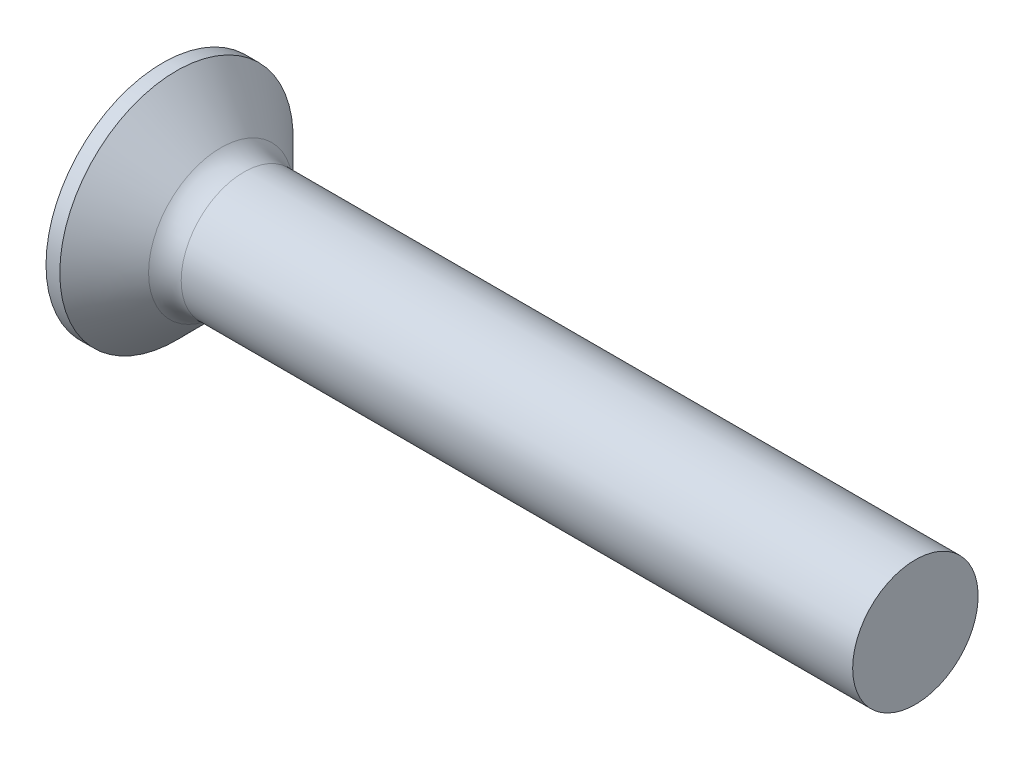
ISO-10303-21;
HEADER;
FILE_DESCRIPTION(('STEP AP214'),'2;1');
FILE_NAME('part.step','',(''),(''),'','','');
FILE_SCHEMA(('AUTOMOTIVE_DESIGN { 1 0 10303 214 1 1 1 1 }'));
ENDSEC;
DATA;
#1=APPLICATION_CONTEXT('core data for automotive mechanical design processes');
#2=APPLICATION_PROTOCOL_DEFINITION('international standard','automotive_design',2000,#1);
#3=PRODUCT_CONTEXT('',#1,'mechanical');
#4=PRODUCT('Part','Part','',(#3));
#5=PRODUCT_RELATED_PRODUCT_CATEGORY('part','',(#4));
#6=PRODUCT_DEFINITION_FORMATION('','',#4);
#7=PRODUCT_DEFINITION_CONTEXT('part definition',#1,'design');
#8=PRODUCT_DEFINITION('design','',#6,#7);
#9=PRODUCT_DEFINITION_SHAPE('','',#8);
#10=(LENGTH_UNIT() NAMED_UNIT(*) SI_UNIT(.MILLI.,.METRE.));
#11=(NAMED_UNIT(*) PLANE_ANGLE_UNIT() SI_UNIT($,.RADIAN.));
#12=(NAMED_UNIT(*) SI_UNIT($,.STERADIAN.) SOLID_ANGLE_UNIT());
#13=UNCERTAINTY_MEASURE_WITH_UNIT(LENGTH_MEASURE(1.E-05),#10,'distance_accuracy_value','');
#14=(GEOMETRIC_REPRESENTATION_CONTEXT(3) GLOBAL_UNCERTAINTY_ASSIGNED_CONTEXT((#13)) GLOBAL_UNIT_ASSIGNED_CONTEXT((#10,
#11,#12)) REPRESENTATION_CONTEXT('',''));
#15=CARTESIAN_POINT('',(0.,0.,0.));
#16=DIRECTION('',(0.,0.,1.));
#17=DIRECTION('',(1.,0.,0.));
#18=AXIS2_PLACEMENT_3D('',#15,#16,#17);
#19=CARTESIAN_POINT('',(3.05,-0.929326349741566,0.515));
#20=DIRECTION('',(0.,0.,-1.));
#21=DIRECTION('',(0.,1.,0.));
#22=AXIS2_PLACEMENT_3D('',#19,#20,#21);
#23=PLANE('',#22);
#24=DIRECTION('',(0.,-1.,0.));
#25=VECTOR('',#24,1.);
#26=CARTESIAN_POINT('',(0.,2.45,0.515));
#27=LINE('',#26,#25);
#28=CARTESIAN_POINT('',(0.,-0.931375357653026,0.515));
#29=VERTEX_POINT('',#28);
#30=CARTESIAN_POINT('',(0.,-2.45,0.515));
#31=VERTEX_POINT('',#30);
#32=EDGE_CURVE('E341',#29,#31,#27,.T.);
#33=ORIENTED_EDGE('',*,*,#32,.F.);
#34=CARTESIAN_POINT('',(-1.54221347305349,-1.05291860734043,0.515));
#35=CARTESIAN_POINT('',(-1.22007147016316,-1.02783607001973,0.515));
#36=CARTESIAN_POINT('',(-0.89794181675164,-1.002592893973,0.515));
#37=CARTESIAN_POINT('',(-0.253713842852044,-0.951673528807875,0.515));
#38=CARTESIAN_POINT('',(0.0683844773279268,-0.925997335794192,0.515));
#39=CARTESIAN_POINT('',(0.712537341146251,-0.874100649412192,0.515));
#40=CARTESIAN_POINT('',(1.03459188478602,-0.847880156061489,0.515));
#41=CARTESIAN_POINT('',(1.67864013954242,-0.794723210967585,0.515));
#42=CARTESIAN_POINT('',(2.0006338510091,-0.767786763479056,0.515));
#43=CARTESIAN_POINT('',(2.56056239677505,-0.720091607539809,0.515));
#44=CARTESIAN_POINT('',(2.7985160340986,-0.699554136185312,0.515));
#45=CARTESIAN_POINT('',(3.27436149939218,-0.657782810112313,0.515));
#46=CARTESIAN_POINT('',(3.51225332755344,-0.636548957574876,0.515));
#47=CARTESIAN_POINT('',(3.98796007755392,-0.59316517097504,0.515));
#48=CARTESIAN_POINT('',(4.22577499737104,-0.571015214531953,0.515));
#49=CARTESIAN_POINT('',(4.70127802763926,-0.525368927832394,0.515));
#50=CARTESIAN_POINT('',(4.93896613655203,-0.50187258160175,0.515));
#51=CARTESIAN_POINT('',(5.17656597464715,-0.477487906778812,0.515));
#52=B_SPLINE_CURVE_WITH_KNOTS('',3,(#34,#35,#36,#37,#38,#39,#40,#41,#42,#43,#44,#45,#46,#47,#48,
#49,#50,#51),.UNSPECIFIED.,.F.,.F.,(4,2,2,2,2,2,2,2,4),(0.,0.969351235948301,1.93871119655371,
2.90807112578744,3.87742529573196,4.59393929763426,5.3104510556289,6.0269803285681,
6.74351810449256),.UNSPECIFIED.);
#53=CARTESIAN_POINT('',(3.05,-0.677477674908922,0.515));
#54=VERTEX_POINT('',#53);
#55=EDGE_CURVE('E198',#29,#54,#52,.T.);
#56=ORIENTED_EDGE('',*,*,#55,.T.);
#57=DIRECTION('',(0.,-1.,0.));
#58=VECTOR('',#57,1.);
#59=CARTESIAN_POINT('',(3.05,0.929326349741566,0.515));
#60=LINE('',#59,#58);
#61=CARTESIAN_POINT('',(3.05,-0.929326349741566,0.515));
#62=VERTEX_POINT('',#61);
#63=EDGE_CURVE('E373',#54,#62,#60,.T.);
#64=ORIENTED_EDGE('',*,*,#63,.T.);
#65=DIRECTION('',(0.894934391398443,0.446197753347436,0.));
#66=VECTOR('',#65,1.);
#67=CARTESIAN_POINT('',(0.,-2.45,0.515));
#68=LINE('',#67,#66);
#69=EDGE_CURVE('E355',#31,#62,#68,.T.);
#70=ORIENTED_EDGE('',*,*,#69,.F.);
#71=EDGE_LOOP('',(#33,#56,#64,#70));
#72=FACE_BOUND('',#71,.T.);
#73=ADVANCED_FACE('F39',(#72),#23,.T.);
#74=CARTESIAN_POINT('',(3.05,0.929326349741566,0.515));
#75=VERTEX_POINT('',#74);
#76=CARTESIAN_POINT('',(3.05,0.677477674908922,0.515));
#77=VERTEX_POINT('',#76);
#78=EDGE_CURVE('E375',#75,#77,#60,.T.);
#79=ORIENTED_EDGE('',*,*,#78,.T.);
#80=CARTESIAN_POINT('',(-1.54221347305349,1.05291860734043,0.515));
#81=CARTESIAN_POINT('',(-1.22007147016316,1.02783607001973,0.515));
#82=CARTESIAN_POINT('',(-0.89794181675164,1.002592893973,0.515));
#83=CARTESIAN_POINT('',(-0.253713842852044,0.951673528807875,0.515));
#84=CARTESIAN_POINT('',(0.0683844773279269,0.925997335794192,0.515));
#85=CARTESIAN_POINT('',(0.712537341146252,0.874100649412192,0.515));
#86=CARTESIAN_POINT('',(1.03459188478602,0.847880156061489,0.515));
#87=CARTESIAN_POINT('',(1.67864013954242,0.794723210967585,0.515));
#88=CARTESIAN_POINT('',(2.0006338510091,0.767786763479056,0.515));
#89=CARTESIAN_POINT('',(2.56056239677505,0.720091607539809,0.515));
#90=CARTESIAN_POINT('',(2.7985160340986,0.699554136185312,0.515));
#91=CARTESIAN_POINT('',(3.27436149939217,0.657782810112313,0.515));
#92=CARTESIAN_POINT('',(3.51225332755344,0.636548957574876,0.515));
#93=CARTESIAN_POINT('',(3.98796007755392,0.59316517097504,0.515));
#94=CARTESIAN_POINT('',(4.22577499737104,0.571015214531953,0.515));
#95=CARTESIAN_POINT('',(4.70127802763926,0.525368927832394,0.515));
#96=CARTESIAN_POINT('',(4.93896613655203,0.50187258160175,0.515));
#97=CARTESIAN_POINT('',(5.17656597464715,0.477487906778812,0.515));
#98=B_SPLINE_CURVE_WITH_KNOTS('',3,(#80,#81,#82,#83,#84,#85,#86,#87,#88,#89,#90,#91,#92,#93,#94,
#95,#96,#97),.UNSPECIFIED.,.F.,.F.,(4,2,2,2,2,2,2,2,4),(0.,0.969351235948301,1.93871119655371,
2.90807112578744,3.87742529573196,4.59393929763426,5.3104510556289,6.0269803285681,
6.74351810449256),.UNSPECIFIED.);
#99=CARTESIAN_POINT('',(0.,0.931375357653026,0.515));
#100=VERTEX_POINT('',#99);
#101=EDGE_CURVE('E191',#77,#100,#98,.F.);
#102=ORIENTED_EDGE('',*,*,#101,.T.);
#103=CARTESIAN_POINT('',(0.,2.45,0.515));
#104=VERTEX_POINT('',#103);
#105=EDGE_CURVE('E343',#104,#100,#27,.T.);
#106=ORIENTED_EDGE('',*,*,#105,.F.);
#107=DIRECTION('',(0.894934391398443,-0.446197753347436,0.));
#108=VECTOR('',#107,1.);
#109=CARTESIAN_POINT('',(0.,2.45,0.515));
#110=LINE('',#109,#108);
#111=EDGE_CURVE('E69',#104,#75,#110,.T.);
#112=ORIENTED_EDGE('',*,*,#111,.T.);
#113=EDGE_LOOP('',(#79,#102,#106,#112));
#114=FACE_BOUND('',#113,.T.);
#115=ADVANCED_FACE('F173',(#114),#23,.T.);
#116=CARTESIAN_POINT('',(3.05,0.929326349741566,-0.515));
#117=DIRECTION('',(0.,0.,1.));
#118=DIRECTION('',(1.,0.,0.));
#119=AXIS2_PLACEMENT_3D('',#116,#117,#118);
#120=PLANE('',#119);
#121=DIRECTION('',(0.,1.,0.));
#122=VECTOR('',#121,1.);
#123=CARTESIAN_POINT('',(3.05,-0.929326349741566,-0.515));
#124=LINE('',#123,#122);
#125=CARTESIAN_POINT('',(3.05,-0.929326349741566,-0.515));
#126=VERTEX_POINT('',#125);
#127=CARTESIAN_POINT('',(3.05,-0.677477674908922,-0.515));
#128=VERTEX_POINT('',#127);
#129=EDGE_CURVE('E374',#126,#128,#124,.T.);
#130=ORIENTED_EDGE('',*,*,#129,.T.);
#131=CARTESIAN_POINT('',(-1.54221347058903,-1.05291860714859,-0.515));
#132=CARTESIAN_POINT('',(-1.22007146800241,-1.02783606985067,-0.515));
#133=CARTESIAN_POINT('',(-0.897941814894599,-1.00259289382691,-0.515));
#134=CARTESIAN_POINT('',(-0.253713841602368,-0.951673528708394,-0.515));
#135=CARTESIAN_POINT('',(0.0683844782739385,-0.925997335718345,-0.515));
#136=CARTESIAN_POINT('',(0.712537341258934,-0.874100649402746,-0.515));
#137=CARTESIAN_POINT('',(1.03459188436907,-0.847880156095195,-0.515));
#138=CARTESIAN_POINT('',(1.67864013806642,-0.794723211090119,-0.515));
#139=CARTESIAN_POINT('',(2.00063384900369,-0.767786763647266,-0.515));
#140=CARTESIAN_POINT('',(2.56056239424054,-0.720091607757629,-0.515));
#141=CARTESIAN_POINT('',(2.79851603156427,-0.699554136405275,-0.515));
#142=CARTESIAN_POINT('',(3.27436149685826,-0.657782810337244,-0.515));
#143=CARTESIAN_POINT('',(3.51225332501977,-0.636548957802634,-0.515));
#144=CARTESIAN_POINT('',(3.98796007502083,-0.593165171209449,-0.515));
#145=CARTESIAN_POINT('',(4.22577499483828,-0.571015214770186,-0.515));
#146=CARTESIAN_POINT('',(4.70127802510735,-0.525368928080089,-0.515));
#147=CARTESIAN_POINT('',(4.93896613402064,-0.501872581855082,-0.515));
#148=CARTESIAN_POINT('',(5.17656597211643,-0.477487907039094,-0.515));
#149=B_SPLINE_CURVE_WITH_KNOTS('',3,(#131,#132,#133,#134,#135,#136,#137,#138,#139,#140,#141,
#142,#143,#144,#145,#146,#147,#148),.UNSPECIFIED.,.F.,.F.,(4,2,2,2,2,2,2,2,4),(0.,
0.9693512350346,1.93871119472626,2.90807112236582,3.87742529071622,4.59393929261848,
5.3104510506131,6.02698032355223,6.74351809947659),.UNSPECIFIED.);
#150=CARTESIAN_POINT('',(0.,-0.931375357653026,-0.515));
#151=VERTEX_POINT('',#150);
#152=EDGE_CURVE('E245',#128,#151,#149,.F.);
#153=ORIENTED_EDGE('',*,*,#152,.T.);
#154=DIRECTION('',(0.,1.,0.));
#155=VECTOR('',#154,1.);
#156=CARTESIAN_POINT('',(0.,-2.45,-0.515));
#157=LINE('',#156,#155);
#158=CARTESIAN_POINT('',(0.,-2.45,-0.515));
#159=VERTEX_POINT('',#158);
#160=EDGE_CURVE('E342',#159,#151,#157,.T.);
#161=ORIENTED_EDGE('',*,*,#160,.F.);
#162=DIRECTION('',(0.894934391398443,0.446197753347436,0.));
#163=VECTOR('',#162,1.);
#164=CARTESIAN_POINT('',(0.,-2.45,-0.515));
#165=LINE('',#164,#163);
#166=EDGE_CURVE('E359',#159,#126,#165,.T.);
#167=ORIENTED_EDGE('',*,*,#166,.T.);
#168=EDGE_LOOP('',(#130,#153,#161,#167));
#169=FACE_BOUND('',#168,.T.);
#170=ADVANCED_FACE('F179',(#169),#120,.T.);
#171=CARTESIAN_POINT('',(0.,0.931375357653026,-0.515));
#172=VERTEX_POINT('',#171);
#173=CARTESIAN_POINT('',(0.,2.45,-0.515));
#174=VERTEX_POINT('',#173);
#175=EDGE_CURVE('E354',#172,#174,#157,.T.);
#176=ORIENTED_EDGE('',*,*,#175,.F.);
#177=CARTESIAN_POINT('',(-1.54221347058903,1.05291860714859,-0.515));
#178=CARTESIAN_POINT('',(-1.22007146800241,1.02783606985067,-0.515));
#179=CARTESIAN_POINT('',(-0.897941814894599,1.00259289382691,-0.515));
#180=CARTESIAN_POINT('',(-0.253713841602368,0.951673528708394,-0.515));
#181=CARTESIAN_POINT('',(0.0683844782739385,0.925997335718345,-0.515));
#182=CARTESIAN_POINT('',(0.712537341258934,0.874100649402746,-0.515));
#183=CARTESIAN_POINT('',(1.03459188436907,0.847880156095195,-0.515));
#184=CARTESIAN_POINT('',(1.67864013806642,0.794723211090119,-0.515));
#185=CARTESIAN_POINT('',(2.00063384900369,0.767786763647266,-0.515));
#186=CARTESIAN_POINT('',(2.56056239424054,0.720091607757629,-0.515));
#187=CARTESIAN_POINT('',(2.79851603156427,0.699554136405275,-0.515));
#188=CARTESIAN_POINT('',(3.27436149685826,0.657782810337244,-0.515));
#189=CARTESIAN_POINT('',(3.51225332501977,0.636548957802634,-0.515));
#190=CARTESIAN_POINT('',(3.98796007502083,0.593165171209449,-0.515));
#191=CARTESIAN_POINT('',(4.22577499483827,0.571015214770186,-0.515));
#192=CARTESIAN_POINT('',(4.70127802510734,0.525368928080089,-0.515));
#193=CARTESIAN_POINT('',(4.93896613402064,0.501872581855082,-0.515));
#194=CARTESIAN_POINT('',(5.17656597211643,0.477487907039095,-0.515));
#195=B_SPLINE_CURVE_WITH_KNOTS('',3,(#177,#178,#179,#180,#181,#182,#183,#184,#185,#186,#187,
#188,#189,#190,#191,#192,#193,#194),.UNSPECIFIED.,.F.,.F.,(4,2,2,2,2,2,2,2,4),(0.,
0.9693512350346,1.93871119472626,2.90807112236582,3.87742529071622,4.59393929261848,
5.3104510506131,6.02698032355223,6.74351809947659),.UNSPECIFIED.);
#196=CARTESIAN_POINT('',(3.05,0.677477674908922,-0.515));
#197=VERTEX_POINT('',#196);
#198=EDGE_CURVE('E240',#172,#197,#195,.T.);
#199=ORIENTED_EDGE('',*,*,#198,.T.);
#200=CARTESIAN_POINT('',(3.05,0.929326349741566,-0.515));
#201=VERTEX_POINT('',#200);
#202=EDGE_CURVE('E383',#197,#201,#124,.T.);
#203=ORIENTED_EDGE('',*,*,#202,.T.);
#204=DIRECTION('',(0.894934391398443,-0.446197753347436,0.));
#205=VECTOR('',#204,1.);
#206=CARTESIAN_POINT('',(0.,2.45,-0.515));
#207=LINE('',#206,#205);
#208=EDGE_CURVE('E365',#174,#201,#207,.T.);
#209=ORIENTED_EDGE('',*,*,#208,.F.);
#210=EDGE_LOOP('',(#176,#199,#203,#209));
#211=FACE_BOUND('',#210,.T.);
#212=ADVANCED_FACE('F477',(#211),#120,.T.);
#213=CARTESIAN_POINT('',(3.05,0.929326349741566,-0.515));
#214=DIRECTION('',(1.,0.,0.));
#215=DIRECTION('',(0.,0.,-1.));
#216=AXIS2_PLACEMENT_3D('',#213,#214,#215);
#217=PLANE('',#216);
#218=CARTESIAN_POINT('',(3.05,0.,0.));
#219=DIRECTION('',(-1.,0.,0.));
#220=DIRECTION('',(0.,0.,1.));
#221=AXIS2_PLACEMENT_3D('',#218,#219,#220);
#222=CIRCLE('',#221,0.850999999999999);
#223=EDGE_CURVE('E303',#128,#54,#222,.T.);
#224=ORIENTED_EDGE('',*,*,#223,.F.);
#225=ORIENTED_EDGE('',*,*,#129,.F.);
#226=DIRECTION('',(0.,0.,-1.));
#227=VECTOR('',#226,1.);
#228=CARTESIAN_POINT('',(3.05,-0.929326349741566,0.515));
#229=LINE('',#228,#227);
#230=EDGE_CURVE('E369',#62,#126,#229,.T.);
#231=ORIENTED_EDGE('',*,*,#230,.F.);
#232=ORIENTED_EDGE('',*,*,#63,.F.);
#233=EDGE_LOOP('',(#224,#225,#231,#232));
#234=FACE_BOUND('',#233,.T.);
#235=ADVANCED_FACE('F472',(#234),#217,.F.);
#236=CARTESIAN_POINT('',(3.05,-0.515000000000002,0.67747767490892));
#237=VERTEX_POINT('',#236);
#238=CARTESIAN_POINT('',(3.05,0.514999999999998,0.677477674908924));
#239=VERTEX_POINT('',#238);
#240=EDGE_CURVE('E293',#237,#239,#222,.T.);
#241=ORIENTED_EDGE('',*,*,#240,.F.);
#242=DIRECTION('',(0.,0.,-1.));
#243=VECTOR('',#242,1.);
#244=CARTESIAN_POINT('',(3.05,-0.515000000000003,0.929326349741565));
#245=LINE('',#244,#243);
#246=CARTESIAN_POINT('',(3.05,-0.515000000000003,0.929326349741565));
#247=VERTEX_POINT('',#246);
#248=EDGE_CURVE('E454',#247,#237,#245,.T.);
#249=ORIENTED_EDGE('',*,*,#248,.F.);
#250=DIRECTION('',(0.,-1.,0.));
#251=VECTOR('',#250,1.);
#252=CARTESIAN_POINT('',(3.05,0.514999999999997,0.929326349741568));
#253=LINE('',#252,#251);
#254=CARTESIAN_POINT('',(3.05,0.514999999999997,0.929326349741568));
#255=VERTEX_POINT('',#254);
#256=EDGE_CURVE('E327',#255,#247,#253,.T.);
#257=ORIENTED_EDGE('',*,*,#256,.F.);
#258=DIRECTION('',(0.,0.,1.));
#259=VECTOR('',#258,1.);
#260=CARTESIAN_POINT('',(3.05,0.515000000000003,-0.929326349741565));
#261=LINE('',#260,#259);
#262=EDGE_CURVE('E206',#239,#255,#261,.T.);
#263=ORIENTED_EDGE('',*,*,#262,.F.);
#264=EDGE_LOOP('',(#241,#249,#257,#263));
#265=FACE_BOUND('',#264,.T.);
#266=ADVANCED_FACE('F518',(#265),#217,.F.);
#267=EDGE_CURVE('E292',#77,#197,#222,.T.);
#268=ORIENTED_EDGE('',*,*,#267,.F.);
#269=ORIENTED_EDGE('',*,*,#78,.F.);
#270=DIRECTION('',(0.,0.,1.));
#271=VECTOR('',#270,1.);
#272=CARTESIAN_POINT('',(3.05,0.929326349741566,-0.515));
#273=LINE('',#272,#271);
#274=EDGE_CURVE('E370',#201,#75,#273,.T.);
#275=ORIENTED_EDGE('',*,*,#274,.F.);
#276=ORIENTED_EDGE('',*,*,#202,.F.);
#277=EDGE_LOOP('',(#268,#269,#275,#276));
#278=FACE_BOUND('',#277,.T.);
#279=ADVANCED_FACE('F480',(#278),#217,.F.);
#280=CARTESIAN_POINT('',(3.05,0.514999999999997,0.929326349741568));
#281=DIRECTION('',(0.,-1.,0.));
#282=DIRECTION('',(1.,0.,0.));
#283=AXIS2_PLACEMENT_3D('',#280,#281,#282);
#284=PLANE('',#283);
#285=CARTESIAN_POINT('',(3.05,0.515000000000003,-0.929326349741565));
#286=VERTEX_POINT('',#285);
#287=CARTESIAN_POINT('',(3.05,0.515000000000002,-0.67747767490892));
#288=VERTEX_POINT('',#287);
#289=EDGE_CURVE('E321',#286,#288,#261,.T.);
#290=ORIENTED_EDGE('',*,*,#289,.T.);
#291=CARTESIAN_POINT('',(-1.54221347058903,0.515000000000004,-1.05291860714859));
#292=CARTESIAN_POINT('',(-1.22007146800242,0.515000000000003,-1.02783606985067));
#293=CARTESIAN_POINT('',(-0.897941814894599,0.515000000000003,-1.00259289382691));
#294=CARTESIAN_POINT('',(-0.253713841602369,0.515000000000003,-0.951673528708392));
#295=CARTESIAN_POINT('',(0.0683844782739381,0.515000000000003,-0.925997335718343));
#296=CARTESIAN_POINT('',(0.712537341258934,0.515000000000003,-0.874100649402745));
#297=CARTESIAN_POINT('',(1.03459188436907,0.515000000000003,-0.847880156095193));
#298=CARTESIAN_POINT('',(1.67864013806642,0.515000000000003,-0.794723211090117));
#299=CARTESIAN_POINT('',(2.00063384900369,0.515000000000003,-0.767786763647264));
#300=CARTESIAN_POINT('',(2.56056239424054,0.515000000000003,-0.720091607757627));
#301=CARTESIAN_POINT('',(2.79851603156427,0.515000000000003,-0.699554136405273));
#302=CARTESIAN_POINT('',(3.27436149685826,0.515000000000002,-0.657782810337243));
#303=CARTESIAN_POINT('',(3.51225332501977,0.515000000000002,-0.636548957802632));
#304=CARTESIAN_POINT('',(3.98796007502083,0.515000000000002,-0.593165171209447));
#305=CARTESIAN_POINT('',(4.22577499483828,0.515000000000002,-0.571015214770184));
#306=CARTESIAN_POINT('',(4.70127802510735,0.515000000000002,-0.525368928080087));
#307=CARTESIAN_POINT('',(4.93896613402064,0.515000000000002,-0.50187258185508));
#308=CARTESIAN_POINT('',(5.17656597211643,0.515000000000002,-0.477487907039093));
#309=B_SPLINE_CURVE_WITH_KNOTS('',3,(#291,#292,#293,#294,#295,#296,#297,#298,#299,#300,#301,
#302,#303,#304,#305,#306,#307,#308),.UNSPECIFIED.,.F.,.F.,(4,2,2,2,2,2,2,2,4),(0.,
0.969351235034599,1.93871119472626,2.90807112236582,3.87742529071622,4.59393929261848,
5.3104510506131,6.02698032355223,6.74351809947659),.UNSPECIFIED.);
#310=CARTESIAN_POINT('',(0.,0.515000000000003,-0.931375357653024));
#311=VERTEX_POINT('',#310);
#312=EDGE_CURVE('E233',#288,#311,#309,.F.);
#313=ORIENTED_EDGE('',*,*,#312,.T.);
#314=DIRECTION('',(0.,0.,1.));
#315=VECTOR('',#314,1.);
#316=CARTESIAN_POINT('',(0.,0.515000000000009,-2.45));
#317=LINE('',#316,#315);
#318=CARTESIAN_POINT('',(0.,0.515000000000009,-2.45));
#319=VERTEX_POINT('',#318);
#320=EDGE_CURVE('E438',#319,#311,#317,.T.);
#321=ORIENTED_EDGE('',*,*,#320,.F.);
#322=DIRECTION('',(0.894934391398443,0.,0.446197753347436));
#323=VECTOR('',#322,1.);
#324=CARTESIAN_POINT('',(0.,0.515000000000009,-2.45));
#325=LINE('',#324,#323);
#326=EDGE_CURVE('E325',#319,#286,#325,.T.);
#327=ORIENTED_EDGE('',*,*,#326,.T.);
#328=EDGE_LOOP('',(#290,#313,#321,#327));
#329=FACE_BOUND('',#328,.T.);
#330=ADVANCED_FACE('F324',(#329),#284,.T.);
#331=CARTESIAN_POINT('',(3.05,-0.514999999999997,-0.929326349741568));
#332=DIRECTION('',(0.,1.,0.));
#333=DIRECTION('',(0.,0.,1.));
#334=AXIS2_PLACEMENT_3D('',#331,#332,#333);
#335=PLANE('',#334);
#336=DIRECTION('',(0.,0.,-1.));
#337=VECTOR('',#336,1.);
#338=CARTESIAN_POINT('',(0.,-0.515000000000008,2.45));
#339=LINE('',#338,#337);
#340=CARTESIAN_POINT('',(0.,-0.514999999999997,-0.931375357653028));
#341=VERTEX_POINT('',#340);
#342=CARTESIAN_POINT('',(0.,-0.514999999999992,-2.45));
#343=VERTEX_POINT('',#342);
#344=EDGE_CURVE('E432',#341,#343,#339,.T.);
#345=ORIENTED_EDGE('',*,*,#344,.F.);
#346=CARTESIAN_POINT('',(-1.54221347058903,-0.514999999999996,-1.05291860714859));
#347=CARTESIAN_POINT('',(-1.22007146800241,-0.514999999999997,-1.02783606985067));
#348=CARTESIAN_POINT('',(-0.897941814894598,-0.514999999999997,-1.00259289382691));
#349=CARTESIAN_POINT('',(-0.253713841602368,-0.514999999999997,-0.951673528708396));
#350=CARTESIAN_POINT('',(0.0683844782739389,-0.514999999999997,-0.925997335718346));
#351=CARTESIAN_POINT('',(0.712537341258934,-0.514999999999997,-0.874100649402748));
#352=CARTESIAN_POINT('',(1.03459188436907,-0.514999999999997,-0.847880156095197));
#353=CARTESIAN_POINT('',(1.67864013806642,-0.514999999999997,-0.794723211090121));
#354=CARTESIAN_POINT('',(2.00063384900369,-0.514999999999997,-0.767786763647268));
#355=CARTESIAN_POINT('',(2.56056239424054,-0.514999999999998,-0.72009160775763));
#356=CARTESIAN_POINT('',(2.79851603156427,-0.514999999999998,-0.699554136405276));
#357=CARTESIAN_POINT('',(3.27436149685826,-0.514999999999998,-0.657782810337246));
#358=CARTESIAN_POINT('',(3.51225332501977,-0.514999999999998,-0.636548957802636));
#359=CARTESIAN_POINT('',(3.98796007502083,-0.514999999999998,-0.59316517120945));
#360=CARTESIAN_POINT('',(4.22577499483828,-0.514999999999998,-0.571015214770188));
#361=CARTESIAN_POINT('',(4.70127802510735,-0.514999999999999,-0.52536892808009));
#362=CARTESIAN_POINT('',(4.93896613402064,-0.514999999999999,-0.501872581855084));
#363=CARTESIAN_POINT('',(5.17656597211643,-0.514999999999999,-0.477487907039096));
#364=B_SPLINE_CURVE_WITH_KNOTS('',3,(#346,#347,#348,#349,#350,#351,#352,#353,#354,#355,#356,
#357,#358,#359,#360,#361,#362,#363),.UNSPECIFIED.,.F.,.F.,(4,2,2,2,2,2,2,2,4),(0.,
0.969351235034601,1.93871119472626,2.90807112236582,3.87742529071622,4.59393929261848,
5.3104510506131,6.02698032355223,6.74351809947659),.UNSPECIFIED.);
#365=CARTESIAN_POINT('',(3.05,-0.514999999999998,-0.677477674908923));
#366=VERTEX_POINT('',#365);
#367=EDGE_CURVE('E226',#341,#366,#364,.T.);
#368=ORIENTED_EDGE('',*,*,#367,.T.);
#369=CARTESIAN_POINT('',(3.05,-0.514999999999997,-0.929326349741568));
#370=VERTEX_POINT('',#369);
#371=EDGE_CURVE('E323',#366,#370,#245,.T.);
#372=ORIENTED_EDGE('',*,*,#371,.T.);
#373=DIRECTION('',(0.894934391398443,0.,0.446197753347436));
#374=VECTOR('',#373,1.);
#375=CARTESIAN_POINT('',(0.,-0.514999999999992,-2.45));
#376=LINE('',#375,#374);
#377=EDGE_CURVE('E442',#343,#370,#376,.T.);
#378=ORIENTED_EDGE('',*,*,#377,.F.);
#379=EDGE_LOOP('',(#345,#368,#372,#378));
#380=FACE_BOUND('',#379,.T.);
#381=ADVANCED_FACE('F460',(#380),#335,.T.);
#382=ORIENTED_EDGE('',*,*,#248,.T.);
#383=CARTESIAN_POINT('',(-1.54221347305349,-0.515000000000003,1.05291860734043));
#384=CARTESIAN_POINT('',(-1.22007147016316,-0.515000000000003,1.02783607001973));
#385=CARTESIAN_POINT('',(-0.89794181675164,-0.515000000000003,1.002592893973));
#386=CARTESIAN_POINT('',(-0.253713842852044,-0.515000000000003,0.951673528807873));
#387=CARTESIAN_POINT('',(0.0683844773279267,-0.515000000000003,0.92599733579419));
#388=CARTESIAN_POINT('',(0.712537341146251,-0.515000000000003,0.87410064941219));
#389=CARTESIAN_POINT('',(1.03459188478602,-0.515000000000003,0.847880156061488));
#390=CARTESIAN_POINT('',(1.67864013954242,-0.515000000000003,0.794723210967584));
#391=CARTESIAN_POINT('',(2.0006338510091,-0.515000000000003,0.767786763479054));
#392=CARTESIAN_POINT('',(2.56056239677505,-0.515000000000003,0.720091607539807));
#393=CARTESIAN_POINT('',(2.7985160340986,-0.515000000000003,0.69955413618531));
#394=CARTESIAN_POINT('',(3.27436149939218,-0.515000000000002,0.657782810112311));
#395=CARTESIAN_POINT('',(3.51225332755344,-0.515000000000002,0.636548957574874));
#396=CARTESIAN_POINT('',(3.98796007755392,-0.515000000000002,0.593165170975038));
#397=CARTESIAN_POINT('',(4.22577499737104,-0.515000000000002,0.571015214531951));
#398=CARTESIAN_POINT('',(4.70127802763926,-0.515000000000002,0.525368927832392));
#399=CARTESIAN_POINT('',(4.93896613655203,-0.515000000000002,0.501872581601749));
#400=CARTESIAN_POINT('',(5.17656597464715,-0.515000000000002,0.47748790677881));
#401=B_SPLINE_CURVE_WITH_KNOTS('',3,(#383,#384,#385,#386,#387,#388,#389,#390,#391,#392,#393,
#394,#395,#396,#397,#398,#399,#400),.UNSPECIFIED.,.F.,.F.,(4,2,2,2,2,2,2,2,4),(0.,
0.969351235948301,1.93871119655371,2.90807112578744,3.87742529573196,4.59393929763426,
5.3104510556289,6.0269803285681,6.74351810449256),.UNSPECIFIED.);
#402=CARTESIAN_POINT('',(0.,-0.515000000000003,0.931375357653024));
#403=VERTEX_POINT('',#402);
#404=EDGE_CURVE('E218',#237,#403,#401,.F.);
#405=ORIENTED_EDGE('',*,*,#404,.T.);
#406=CARTESIAN_POINT('',(0.,-0.515000000000008,2.45));
#407=VERTEX_POINT('',#406);
#408=EDGE_CURVE('E427',#407,#403,#339,.T.);
#409=ORIENTED_EDGE('',*,*,#408,.F.);
#410=DIRECTION('',(0.894934391398443,0.,-0.446197753347436));
#411=VECTOR('',#410,1.);
#412=CARTESIAN_POINT('',(0.,-0.515000000000008,2.45));
#413=LINE('',#412,#411);
#414=EDGE_CURVE('E448',#407,#247,#413,.T.);
#415=ORIENTED_EDGE('',*,*,#414,.T.);
#416=EDGE_LOOP('',(#382,#405,#409,#415));
#417=FACE_BOUND('',#416,.T.);
#418=ADVANCED_FACE('F500',(#417),#335,.T.);
#419=CARTESIAN_POINT('',(0.,0.514999999999997,0.931375357653028));
#420=VERTEX_POINT('',#419);
#421=CARTESIAN_POINT('',(0.,0.514999999999991,2.45));
#422=VERTEX_POINT('',#421);
#423=EDGE_CURVE('E441',#420,#422,#317,.T.);
#424=ORIENTED_EDGE('',*,*,#423,.F.);
#425=CARTESIAN_POINT('',(-1.54221347058903,0.514999999999996,1.05291860714859));
#426=CARTESIAN_POINT('',(-1.22007146800241,0.514999999999996,1.02783606985067));
#427=CARTESIAN_POINT('',(-0.897941814894599,0.514999999999996,1.00259289382691));
#428=CARTESIAN_POINT('',(-0.253713841602368,0.514999999999997,0.951673528708396));
#429=CARTESIAN_POINT('',(0.0683844782739385,0.514999999999997,0.925997335718346));
#430=CARTESIAN_POINT('',(0.712537341258934,0.514999999999997,0.874100649402748));
#431=CARTESIAN_POINT('',(1.03459188436907,0.514999999999997,0.847880156095197));
#432=CARTESIAN_POINT('',(1.67864013806642,0.514999999999997,0.794723211090121));
#433=CARTESIAN_POINT('',(2.00063384900369,0.514999999999997,0.767786763647268));
#434=CARTESIAN_POINT('',(2.56056239424054,0.514999999999998,0.720091607757631));
#435=CARTESIAN_POINT('',(2.79851603156427,0.514999999999998,0.699554136405277));
#436=CARTESIAN_POINT('',(3.27436149685826,0.514999999999998,0.657782810337246));
#437=CARTESIAN_POINT('',(3.51225332501977,0.514999999999998,0.636548957802636));
#438=CARTESIAN_POINT('',(3.98796007502083,0.514999999999998,0.593165171209451));
#439=CARTESIAN_POINT('',(4.22577499483827,0.514999999999998,0.571015214770188));
#440=CARTESIAN_POINT('',(4.70127802510734,0.514999999999998,0.525368928080091));
#441=CARTESIAN_POINT('',(4.93896613402064,0.514999999999998,0.501872581855084));
#442=CARTESIAN_POINT('',(5.17656597211643,0.514999999999998,0.477487907039096));
#443=B_SPLINE_CURVE_WITH_KNOTS('',3,(#425,#426,#427,#428,#429,#430,#431,#432,#433,#434,#435,
#436,#437,#438,#439,#440,#441,#442),.UNSPECIFIED.,.F.,.F.,(4,2,2,2,2,2,2,2,4),(0.,
0.9693512350346,1.93871119472626,2.90807112236582,3.87742529071622,4.59393929261848,
5.3104510506131,6.02698032355223,6.74351809947659),.UNSPECIFIED.);
#444=EDGE_CURVE('E11',#420,#239,#443,.T.);
#445=ORIENTED_EDGE('',*,*,#444,.T.);
#446=ORIENTED_EDGE('',*,*,#262,.T.);
#447=DIRECTION('',(0.894934391398443,0.,-0.446197753347436));
#448=VECTOR('',#447,1.);
#449=CARTESIAN_POINT('',(0.,0.514999999999991,2.45));
#450=LINE('',#449,#448);
#451=EDGE_CURVE('E451',#422,#255,#450,.T.);
#452=ORIENTED_EDGE('',*,*,#451,.F.);
#453=EDGE_LOOP('',(#424,#445,#446,#452));
#454=FACE_BOUND('',#453,.T.);
#455=ADVANCED_FACE('F425',(#454),#284,.T.);
#456=CARTESIAN_POINT('',(0.,0.,0.));
#457=DIRECTION('',(-1.,0.,0.));
#458=DIRECTION('',(0.,0.,1.));
#459=AXIS2_PLACEMENT_3D('',#456,#457,#458);
#460=PLANE('',#459);
#461=CARTESIAN_POINT('',(0.,0.,0.));
#462=DIRECTION('',(-1.,0.,0.));
#463=DIRECTION('',(0.,0.,1.));
#464=AXIS2_PLACEMENT_3D('',#461,#462,#463);
#465=CIRCLE('',#464,4.65);
#466=CARTESIAN_POINT('',(0.,0.,4.65));
#467=VERTEX_POINT('',#466);
#468=EDGE_CURVE('E391',#467,#467,#465,.T.);
#469=ORIENTED_EDGE('',*,*,#468,.T.);
#470=EDGE_LOOP('',(#469));
#471=FACE_BOUND('',#470,.T.);
#472=ORIENTED_EDGE('',*,*,#408,.T.);
#473=CARTESIAN_POINT('',(0.,0.,0.));
#474=DIRECTION('',(-1.,0.,0.));
#475=DIRECTION('',(0.,0.,1.));
#476=AXIS2_PLACEMENT_3D('',#473,#474,#475);
#477=CIRCLE('',#476,1.06427677642768);
#478=EDGE_CURVE('E282',#29,#403,#477,.T.);
#479=ORIENTED_EDGE('',*,*,#478,.F.);
#480=ORIENTED_EDGE('',*,*,#32,.T.);
#481=DIRECTION('',(0.,0.,-1.));
#482=VECTOR('',#481,1.);
#483=CARTESIAN_POINT('',(0.,-2.45,0.515));
#484=LINE('',#483,#482);
#485=EDGE_CURVE('E347',#31,#159,#484,.T.);
#486=ORIENTED_EDGE('',*,*,#485,.T.);
#487=ORIENTED_EDGE('',*,*,#160,.T.);
#488=EDGE_CURVE('E285',#341,#151,#477,.T.);
#489=ORIENTED_EDGE('',*,*,#488,.F.);
#490=ORIENTED_EDGE('',*,*,#344,.T.);
#491=DIRECTION('',(0.,1.,0.));
#492=VECTOR('',#491,1.);
#493=CARTESIAN_POINT('',(0.,-0.514999999999992,-2.45));
#494=LINE('',#493,#492);
#495=EDGE_CURVE('E431',#343,#319,#494,.T.);
#496=ORIENTED_EDGE('',*,*,#495,.T.);
#497=ORIENTED_EDGE('',*,*,#320,.T.);
#498=EDGE_CURVE('E281',#172,#311,#477,.T.);
#499=ORIENTED_EDGE('',*,*,#498,.F.);
#500=ORIENTED_EDGE('',*,*,#175,.T.);
#501=DIRECTION('',(0.,0.,1.));
#502=VECTOR('',#501,1.);
#503=CARTESIAN_POINT('',(0.,2.45,-0.515));
#504=LINE('',#503,#502);
#505=EDGE_CURVE('E337',#174,#104,#504,.T.);
#506=ORIENTED_EDGE('',*,*,#505,.T.);
#507=ORIENTED_EDGE('',*,*,#105,.T.);
#508=EDGE_CURVE('E276',#420,#100,#477,.T.);
#509=ORIENTED_EDGE('',*,*,#508,.F.);
#510=ORIENTED_EDGE('',*,*,#423,.T.);
#511=DIRECTION('',(0.,-1.,0.));
#512=VECTOR('',#511,1.);
#513=CARTESIAN_POINT('',(0.,0.514999999999991,2.45));
#514=LINE('',#513,#512);
#515=EDGE_CURVE('E207',#422,#407,#514,.T.);
#516=ORIENTED_EDGE('',*,*,#515,.T.);
#517=EDGE_LOOP('',(#472,#479,#480,#486,#487,#489,#490,#496,#497,#499,#500,#506,#507,#509,#510,#516));
#518=FACE_BOUND('',#517,.T.);
#519=ADVANCED_FACE('F419',(#471,#518),#460,.T.);
#520=CARTESIAN_POINT('',(-6.34999999999999,0.,0.));
#521=DIRECTION('',(-1.,0.,0.));
#522=DIRECTION('',(0.,0.,1.));
#523=AXIS2_PLACEMENT_3D('',#520,#521,#522);
#524=CYLINDRICAL_SURFACE('',#523,4.65);
#525=CARTESIAN_POINT('',(0.550000000000008,0.,0.));
#526=DIRECTION('',(-1.,0.,0.));
#527=DIRECTION('',(0.,0.,1.));
#528=AXIS2_PLACEMENT_3D('',#525,#526,#527);
#529=CIRCLE('',#528,4.65);
#530=CARTESIAN_POINT('',(0.550000000000008,0.,4.65));
#531=VERTEX_POINT('',#530);
#532=EDGE_CURVE('E387',#531,#531,#529,.T.);
#533=ORIENTED_EDGE('',*,*,#532,.T.);
#534=EDGE_LOOP('',(#533));
#535=FACE_BOUND('',#534,.T.);
#536=ORIENTED_EDGE('',*,*,#468,.F.);
#537=EDGE_LOOP('',(#536));
#538=FACE_BOUND('',#537,.T.);
#539=ADVANCED_FACE('F413',(#535,#538),#524,.T.);
#540=CARTESIAN_POINT('',(0.550000000000008,0.,0.));
#541=DIRECTION('',(-1.,0.,0.));
#542=DIRECTION('',(0.,0.,1.));
#543=AXIS2_PLACEMENT_3D('',#540,#541,#542);
#544=CONICAL_SURFACE('',#543,4.65,0.78539816339745);
#545=CARTESIAN_POINT('',(2.31923881554251,0.,0.));
#546=DIRECTION('',(-1.,0.,0.));
#547=DIRECTION('',(0.,0.,1.));
#548=AXIS2_PLACEMENT_3D('',#545,#546,#547);
#549=CIRCLE('',#548,2.88076118445749);
#550=CARTESIAN_POINT('',(2.31923881554251,0.,2.88076118445749));
#551=VERTEX_POINT('',#550);
#552=EDGE_CURVE('E395',#551,#551,#549,.T.);
#553=ORIENTED_EDGE('',*,*,#552,.T.);
#554=EDGE_LOOP('',(#553));
#555=FACE_BOUND('',#554,.T.);
#556=ORIENTED_EDGE('',*,*,#532,.F.);
#557=EDGE_LOOP('',(#556));
#558=FACE_BOUND('',#557,.T.);
#559=ADVANCED_FACE('F410',(#555,#558),#544,.T.);
#560=CARTESIAN_POINT('',(-6.34999999999999,0.,0.));
#561=DIRECTION('',(-1.,0.,0.));
#562=DIRECTION('',(0.,0.,1.));
#563=AXIS2_PLACEMENT_3D('',#560,#561,#562);
#564=CYLINDRICAL_SURFACE('',#563,2.5);
#565=CARTESIAN_POINT('',(3.23847763108503,0.,0.));
#566=DIRECTION('',(-1.,0.,0.));
#567=DIRECTION('',(0.,0.,1.));
#568=AXIS2_PLACEMENT_3D('',#565,#566,#567);
#569=CIRCLE('',#568,2.5);
#570=CARTESIAN_POINT('',(3.23847763108503,0.,2.5));
#571=VERTEX_POINT('',#570);
#572=EDGE_CURVE('E54',#571,#571,#569,.F.);
#573=ORIENTED_EDGE('',*,*,#572,.T.);
#574=EDGE_LOOP('',(#573));
#575=FACE_BOUND('',#574,.T.);
#576=CARTESIAN_POINT('',(30.,0.,0.));
#577=DIRECTION('',(-1.,0.,0.));
#578=DIRECTION('',(0.,0.,1.));
#579=AXIS2_PLACEMENT_3D('',#576,#577,#578);
#580=CIRCLE('',#579,2.5);
#581=CARTESIAN_POINT('',(30.,0.,2.5));
#582=VERTEX_POINT('',#581);
#583=EDGE_CURVE('E351',#582,#582,#580,.T.);
#584=ORIENTED_EDGE('',*,*,#583,.T.);
#585=EDGE_LOOP('',(#584));
#586=FACE_BOUND('',#585,.T.);
#587=ADVANCED_FACE('F402',(#575,#586),#564,.T.);
#588=CARTESIAN_POINT('',(30.,2.5,0.));
#589=DIRECTION('',(1.,0.,0.));
#590=DIRECTION('',(0.,0.,-1.));
#591=AXIS2_PLACEMENT_3D('',#588,#589,#590);
#592=PLANE('',#591);
#593=ORIENTED_EDGE('',*,*,#583,.F.);
#594=EDGE_LOOP('',(#593));
#595=FACE_BOUND('',#594,.T.);
#596=ADVANCED_FACE('F407',(#595),#592,.T.);
#597=CARTESIAN_POINT('',(3.23847763108503,0.,0.));
#598=DIRECTION('',(-1.,0.,0.));
#599=DIRECTION('',(0.,0.,1.));
#600=AXIS2_PLACEMENT_3D('',#597,#598,#599);
#601=TOROIDAL_SURFACE('',#600,3.8,1.3);
#602=ORIENTED_EDGE('',*,*,#572,.F.);
#603=EDGE_LOOP('',(#602));
#604=FACE_BOUND('',#603,.T.);
#605=ORIENTED_EDGE('',*,*,#552,.F.);
#606=EDGE_LOOP('',(#605));
#607=FACE_BOUND('',#606,.T.);
#608=ADVANCED_FACE('F41',(#604,#607),#601,.F.);
#609=EDGE_CURVE('E310',#288,#366,#222,.T.);
#610=ORIENTED_EDGE('',*,*,#609,.F.);
#611=ORIENTED_EDGE('',*,*,#289,.F.);
#612=DIRECTION('',(0.,1.,0.));
#613=VECTOR('',#612,1.);
#614=CARTESIAN_POINT('',(3.05,-0.514999999999997,-0.929326349741568));
#615=LINE('',#614,#613);
#616=EDGE_CURVE('E335',#370,#286,#615,.T.);
#617=ORIENTED_EDGE('',*,*,#616,.F.);
#618=ORIENTED_EDGE('',*,*,#371,.F.);
#619=EDGE_LOOP('',(#610,#611,#617,#618));
#620=FACE_BOUND('',#619,.T.);
#621=ADVANCED_FACE('F319',(#620),#217,.F.);
#622=CARTESIAN_POINT('',(0.,-2.45,-0.515));
#623=DIRECTION('',(-0.446197753347436,0.894934391398443,0.));
#624=DIRECTION('',(-0.894934391398443,-0.446197753347436,0.));
#625=AXIS2_PLACEMENT_3D('',#622,#623,#624);
#626=PLANE('',#625);
#627=ORIENTED_EDGE('',*,*,#166,.F.);
#628=ORIENTED_EDGE('',*,*,#485,.F.);
#629=ORIENTED_EDGE('',*,*,#69,.T.);
#630=ORIENTED_EDGE('',*,*,#230,.T.);
#631=EDGE_LOOP('',(#627,#628,#629,#630));
#632=FACE_BOUND('',#631,.T.);
#633=ADVANCED_FACE('F185',(#632),#626,.T.);
#634=CARTESIAN_POINT('',(3.05,0.929326349741566,0.515));
#635=DIRECTION('',(-0.446197753347436,-0.894934391398443,0.));
#636=DIRECTION('',(0.894934391398443,-0.446197753347436,0.));
#637=AXIS2_PLACEMENT_3D('',#634,#635,#636);
#638=PLANE('',#637);
#639=ORIENTED_EDGE('',*,*,#111,.F.);
#640=ORIENTED_EDGE('',*,*,#505,.F.);
#641=ORIENTED_EDGE('',*,*,#208,.T.);
#642=ORIENTED_EDGE('',*,*,#274,.T.);
#643=EDGE_LOOP('',(#639,#640,#641,#642));
#644=FACE_BOUND('',#643,.T.);
#645=ADVANCED_FACE('F481',(#644),#638,.T.);
#646=CARTESIAN_POINT('',(0.,0.515000000000008,-2.45));
#647=DIRECTION('',(-0.446197753347436,0.,0.894934391398443));
#648=DIRECTION('',(-0.894934391398443,0.,-0.446197753347436));
#649=AXIS2_PLACEMENT_3D('',#646,#647,#648);
#650=PLANE('',#649);
#651=ORIENTED_EDGE('',*,*,#326,.F.);
#652=ORIENTED_EDGE('',*,*,#495,.F.);
#653=ORIENTED_EDGE('',*,*,#377,.T.);
#654=ORIENTED_EDGE('',*,*,#616,.T.);
#655=EDGE_LOOP('',(#651,#652,#653,#654));
#656=FACE_BOUND('',#655,.T.);
#657=ADVANCED_FACE('F211',(#656),#650,.T.);
#658=CARTESIAN_POINT('',(3.05,-0.515000000000003,0.929326349741565));
#659=DIRECTION('',(-0.446197753347436,0.,-0.894934391398443));
#660=DIRECTION('',(0.894934391398443,0.,-0.446197753347436));
#661=AXIS2_PLACEMENT_3D('',#658,#659,#660);
#662=PLANE('',#661);
#663=ORIENTED_EDGE('',*,*,#414,.F.);
#664=ORIENTED_EDGE('',*,*,#515,.F.);
#665=ORIENTED_EDGE('',*,*,#451,.T.);
#666=ORIENTED_EDGE('',*,*,#256,.T.);
#667=EDGE_LOOP('',(#663,#664,#665,#666));
#668=FACE_BOUND('',#667,.T.);
#669=ADVANCED_FACE('F486',(#668),#662,.T.);
#670=CARTESIAN_POINT('',(3.05,0.,0.));
#671=DIRECTION('',(-1.,0.,0.));
#672=DIRECTION('',(0.,0.,1.));
#673=AXIS2_PLACEMENT_3D('',#670,#671,#672);
#674=CONICAL_SURFACE('',#673,0.850999999999999,0.069813170079766);
#675=ORIENTED_EDGE('',*,*,#478,.T.);
#676=ORIENTED_EDGE('',*,*,#404,.F.);
#677=EDGE_CURVE('E299',#54,#237,#222,.T.);
#678=ORIENTED_EDGE('',*,*,#677,.F.);
#679=ORIENTED_EDGE('',*,*,#55,.F.);
#680=EDGE_LOOP('',(#675,#676,#678,#679));
#681=FACE_BOUND('',#680,.T.);
#682=ADVANCED_FACE('F171',(#681),#674,.F.);
#683=EDGE_CURVE('E61',#239,#77,#222,.T.);
#684=ORIENTED_EDGE('',*,*,#683,.F.);
#685=ORIENTED_EDGE('',*,*,#444,.F.);
#686=ORIENTED_EDGE('',*,*,#508,.T.);
#687=ORIENTED_EDGE('',*,*,#101,.F.);
#688=EDGE_LOOP('',(#684,#685,#686,#687));
#689=FACE_BOUND('',#688,.T.);
#690=ADVANCED_FACE('F485',(#689),#674,.F.);
#691=ORIENTED_EDGE('',*,*,#498,.T.);
#692=ORIENTED_EDGE('',*,*,#312,.F.);
#693=EDGE_CURVE('E297',#197,#288,#222,.T.);
#694=ORIENTED_EDGE('',*,*,#693,.F.);
#695=ORIENTED_EDGE('',*,*,#198,.F.);
#696=EDGE_LOOP('',(#691,#692,#694,#695));
#697=FACE_BOUND('',#696,.T.);
#698=ADVANCED_FACE('F169',(#697),#674,.F.);
#699=EDGE_CURVE('E306',#366,#128,#222,.T.);
#700=ORIENTED_EDGE('',*,*,#699,.F.);
#701=ORIENTED_EDGE('',*,*,#367,.F.);
#702=ORIENTED_EDGE('',*,*,#488,.T.);
#703=ORIENTED_EDGE('',*,*,#152,.F.);
#704=EDGE_LOOP('',(#700,#701,#702,#703));
#705=FACE_BOUND('',#704,.T.);
#706=ADVANCED_FACE('F163',(#705),#674,.F.);
#707=CARTESIAN_POINT('',(3.3265066614942,0.,0.));
#708=DIRECTION('',(-1.,0.,0.));
#709=DIRECTION('',(0.,0.,1.));
#710=AXIS2_PLACEMENT_3D('',#707,#708,#709);
#711=CONICAL_SURFACE('',#710,0.,1.25663706143592);
#712=ORIENTED_EDGE('',*,*,#683,.T.);
#713=ORIENTED_EDGE('',*,*,#267,.T.);
#714=ORIENTED_EDGE('',*,*,#693,.T.);
#715=ORIENTED_EDGE('',*,*,#609,.T.);
#716=ORIENTED_EDGE('',*,*,#699,.T.);
#717=ORIENTED_EDGE('',*,*,#223,.T.);
#718=ORIENTED_EDGE('',*,*,#677,.T.);
#719=ORIENTED_EDGE('',*,*,#240,.T.);
#720=EDGE_LOOP('',(#712,#713,#714,#715,#716,#717,#718,#719));
#721=FACE_BOUND('',#720,.T.);
#722=CARTESIAN_POINT('',(3.3265066614942,0.,0.));
#723=VERTEX_POINT('',#722);
#724=VERTEX_LOOP('',#723);
#725=FACE_BOUND('',#724,.T.);
#726=ADVANCED_FACE('F161',(#721,#725),#711,.F.);
#727=CLOSED_SHELL('',(#73,#115,#170,#212,#235,#266,#279,#330,#381,#418,#455,#519,#539,#559,#587,
#596,#608,#621,#633,#645,#657,#669,#682,#690,#698,#706,#726));
#728=MANIFOLD_SOLID_BREP('B2',#727);
#729=ADVANCED_BREP_SHAPE_REPRESENTATION('',(#18,#728),#14);
#730=SHAPE_DEFINITION_REPRESENTATION(#9,#729);
ENDSEC;
END-ISO-10303-21;
